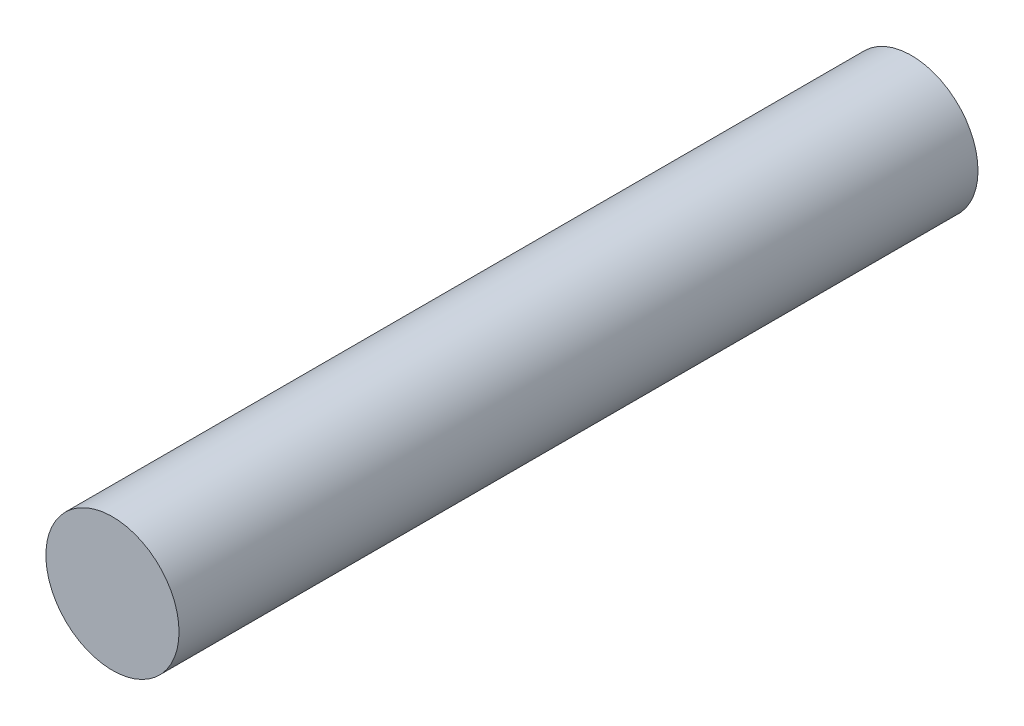
ISO-10303-21;
HEADER;
FILE_DESCRIPTION(('STEP AP214'),'2;1');
FILE_NAME('part.step','',(''),(''),'','','');
FILE_SCHEMA(('AUTOMOTIVE_DESIGN { 1 0 10303 214 1 1 1 1 }'));
ENDSEC;
DATA;
#1=APPLICATION_CONTEXT('core data for automotive mechanical design processes');
#2=APPLICATION_PROTOCOL_DEFINITION('international standard','automotive_design',2000,#1);
#3=PRODUCT_CONTEXT('',#1,'mechanical');
#4=PRODUCT('Part','Part','',(#3));
#5=PRODUCT_RELATED_PRODUCT_CATEGORY('part','',(#4));
#6=PRODUCT_DEFINITION_FORMATION('','',#4);
#7=PRODUCT_DEFINITION_CONTEXT('part definition',#1,'design');
#8=PRODUCT_DEFINITION('design','',#6,#7);
#9=PRODUCT_DEFINITION_SHAPE('','',#8);
#10=(LENGTH_UNIT() NAMED_UNIT(*) SI_UNIT(.MILLI.,.METRE.));
#11=(NAMED_UNIT(*) PLANE_ANGLE_UNIT() SI_UNIT($,.RADIAN.));
#12=(NAMED_UNIT(*) SI_UNIT($,.STERADIAN.) SOLID_ANGLE_UNIT());
#13=UNCERTAINTY_MEASURE_WITH_UNIT(LENGTH_MEASURE(1.E-05),#10,'distance_accuracy_value','');
#14=(GEOMETRIC_REPRESENTATION_CONTEXT(3) GLOBAL_UNCERTAINTY_ASSIGNED_CONTEXT((#13)) GLOBAL_UNIT_ASSIGNED_CONTEXT((#10,
#11,#12)) REPRESENTATION_CONTEXT('',''));
#15=CARTESIAN_POINT('',(0.,0.,0.));
#16=DIRECTION('',(0.,0.,1.));
#17=DIRECTION('',(1.,0.,0.));
#18=AXIS2_PLACEMENT_3D('',#15,#16,#17);
#19=CARTESIAN_POINT('',(0.,0.,27.));
#20=DIRECTION('',(0.,0.,-1.));
#21=DIRECTION('',(-1.,0.,0.));
#22=AXIS2_PLACEMENT_3D('',#19,#20,#21);
#23=CYLINDRICAL_SURFACE('',#22,2.25);
#24=CARTESIAN_POINT('',(0.,0.,27.));
#25=DIRECTION('',(0.,0.,1.));
#26=DIRECTION('',(1.,0.,0.));
#27=AXIS2_PLACEMENT_3D('',#24,#25,#26);
#28=CIRCLE('',#27,2.25);
#29=CARTESIAN_POINT('',(2.25,0.,27.));
#30=VERTEX_POINT('',#29);
#31=EDGE_CURVE('E10',#30,#30,#28,.T.);
#32=ORIENTED_EDGE('',*,*,#31,.F.);
#33=EDGE_LOOP('',(#32));
#34=FACE_BOUND('',#33,.T.);
#35=CARTESIAN_POINT('',(0.,0.,0.));
#36=DIRECTION('',(0.,0.,1.));
#37=DIRECTION('',(1.,0.,0.));
#38=AXIS2_PLACEMENT_3D('',#35,#36,#37);
#39=CIRCLE('',#38,2.25);
#40=CARTESIAN_POINT('',(2.25,0.,0.));
#41=VERTEX_POINT('',#40);
#42=EDGE_CURVE('E44',#41,#41,#39,.T.);
#43=ORIENTED_EDGE('',*,*,#42,.T.);
#44=EDGE_LOOP('',(#43));
#45=FACE_BOUND('',#44,.T.);
#46=ADVANCED_FACE('F41',(#34,#45),#23,.T.);
#47=CARTESIAN_POINT('',(0.,0.,27.));
#48=DIRECTION('',(0.,0.,1.));
#49=DIRECTION('',(1.,0.,0.));
#50=AXIS2_PLACEMENT_3D('',#47,#48,#49);
#51=PLANE('',#50);
#52=ORIENTED_EDGE('',*,*,#31,.T.);
#53=EDGE_LOOP('',(#52));
#54=FACE_BOUND('',#53,.T.);
#55=ADVANCED_FACE('F58',(#54),#51,.T.);
#56=CARTESIAN_POINT('',(0.,0.,0.));
#57=DIRECTION('',(0.,0.,1.));
#58=DIRECTION('',(1.,0.,0.));
#59=AXIS2_PLACEMENT_3D('',#56,#57,#58);
#60=PLANE('',#59);
#61=ORIENTED_EDGE('',*,*,#42,.F.);
#62=EDGE_LOOP('',(#61));
#63=FACE_BOUND('',#62,.T.);
#64=ADVANCED_FACE('F56',(#63),#60,.F.);
#65=CLOSED_SHELL('',(#46,#55,#64));
#66=MANIFOLD_SOLID_BREP('B2',#65);
#67=ADVANCED_BREP_SHAPE_REPRESENTATION('',(#18,#66),#14);
#68=SHAPE_DEFINITION_REPRESENTATION(#9,#67);
ENDSEC;
END-ISO-10303-21;
